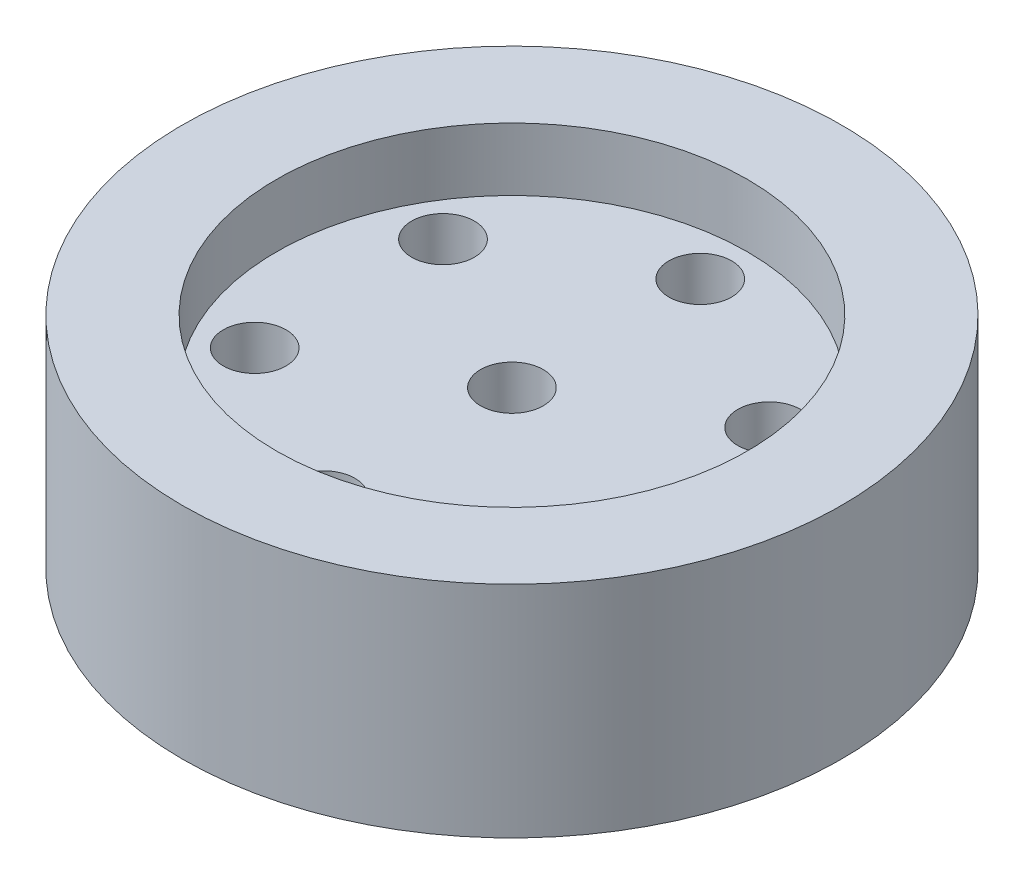
ISO-10303-21;
HEADER;
FILE_DESCRIPTION(('STEP AP214'),'2;1');
FILE_NAME('part.step','',(''),(''),'','','');
FILE_SCHEMA(('AUTOMOTIVE_DESIGN { 1 0 10303 214 1 1 1 1 }'));
ENDSEC;
DATA;
#1=APPLICATION_CONTEXT('core data for automotive mechanical design processes');
#2=APPLICATION_PROTOCOL_DEFINITION('international standard','automotive_design',2000,#1);
#3=PRODUCT_CONTEXT('',#1,'mechanical');
#4=PRODUCT('Part','Part','',(#3));
#5=PRODUCT_RELATED_PRODUCT_CATEGORY('part','',(#4));
#6=PRODUCT_DEFINITION_FORMATION('','',#4);
#7=PRODUCT_DEFINITION_CONTEXT('part definition',#1,'design');
#8=PRODUCT_DEFINITION('design','',#6,#7);
#9=PRODUCT_DEFINITION_SHAPE('','',#8);
#10=(LENGTH_UNIT() NAMED_UNIT(*) SI_UNIT(.MILLI.,.METRE.));
#11=(NAMED_UNIT(*) PLANE_ANGLE_UNIT() SI_UNIT($,.RADIAN.));
#12=(NAMED_UNIT(*) SI_UNIT($,.STERADIAN.) SOLID_ANGLE_UNIT());
#13=UNCERTAINTY_MEASURE_WITH_UNIT(LENGTH_MEASURE(1.E-05),#10,'distance_accuracy_value','');
#14=(GEOMETRIC_REPRESENTATION_CONTEXT(3) GLOBAL_UNCERTAINTY_ASSIGNED_CONTEXT((#13)) GLOBAL_UNIT_ASSIGNED_CONTEXT((#10,
#11,#12)) REPRESENTATION_CONTEXT('',''));
#15=CARTESIAN_POINT('',(0.,0.,0.));
#16=DIRECTION('',(0.,0.,1.));
#17=DIRECTION('',(1.,0.,0.));
#18=AXIS2_PLACEMENT_3D('',#15,#16,#17);
#19=CARTESIAN_POINT('',(0.,7.,0.));
#20=DIRECTION('',(0.,-1.,0.));
#21=DIRECTION('',(0.,0.,-1.));
#22=AXIS2_PLACEMENT_3D('',#19,#20,#21);
#23=CYLINDRICAL_SURFACE('',#22,21.);
#24=CARTESIAN_POINT('',(0.,7.,0.));
#25=DIRECTION('',(0.,1.,0.));
#26=DIRECTION('',(0.,0.,1.));
#27=AXIS2_PLACEMENT_3D('',#24,#25,#26);
#28=CIRCLE('',#27,21.);
#29=CARTESIAN_POINT('',(0.,7.,21.));
#30=VERTEX_POINT('',#29);
#31=EDGE_CURVE('E10',#30,#30,#28,.T.);
#32=ORIENTED_EDGE('',*,*,#31,.F.);
#33=EDGE_LOOP('',(#32));
#34=FACE_BOUND('',#33,.T.);
#35=CARTESIAN_POINT('',(0.,-7.,0.));
#36=DIRECTION('',(0.,1.,0.));
#37=DIRECTION('',(0.,0.,1.));
#38=AXIS2_PLACEMENT_3D('',#35,#36,#37);
#39=CIRCLE('',#38,21.);
#40=CARTESIAN_POINT('',(0.,-7.,21.));
#41=VERTEX_POINT('',#40);
#42=EDGE_CURVE('E49',#41,#41,#39,.T.);
#43=ORIENTED_EDGE('',*,*,#42,.T.);
#44=EDGE_LOOP('',(#43));
#45=FACE_BOUND('',#44,.T.);
#46=ADVANCED_FACE('F41',(#34,#45),#23,.T.);
#47=CARTESIAN_POINT('',(0.,7.,0.));
#48=DIRECTION('',(0.,1.,0.));
#49=DIRECTION('',(0.,0.,1.));
#50=AXIS2_PLACEMENT_3D('',#47,#48,#49);
#51=PLANE('',#50);
#52=CARTESIAN_POINT('',(0.,7.,0.));
#53=DIRECTION('',(0.,1.,0.));
#54=DIRECTION('',(0.,0.,1.));
#55=AXIS2_PLACEMENT_3D('',#52,#53,#54);
#56=CIRCLE('',#55,15.);
#57=CARTESIAN_POINT('',(0.,7.,15.));
#58=VERTEX_POINT('',#57);
#59=EDGE_CURVE('E58',#58,#58,#56,.T.);
#60=ORIENTED_EDGE('',*,*,#59,.F.);
#61=EDGE_LOOP('',(#60));
#62=FACE_BOUND('',#61,.T.);
#63=ORIENTED_EDGE('',*,*,#31,.T.);
#64=EDGE_LOOP('',(#63));
#65=FACE_BOUND('',#64,.T.);
#66=ADVANCED_FACE('F134',(#62,#65),#51,.T.);
#67=CARTESIAN_POINT('',(0.,-7.,0.));
#68=DIRECTION('',(0.,1.,0.));
#69=DIRECTION('',(0.,0.,1.));
#70=AXIS2_PLACEMENT_3D('',#67,#68,#69);
#71=PLANE('',#70);
#72=CARTESIAN_POINT('',(0.,-7.,0.));
#73=DIRECTION('',(0.,-1.,0.));
#74=DIRECTION('',(0.,0.,-1.));
#75=AXIS2_PLACEMENT_3D('',#72,#73,#74);
#76=CIRCLE('',#75,19.);
#77=CARTESIAN_POINT('',(0.,-7.,-19.));
#78=VERTEX_POINT('',#77);
#79=EDGE_CURVE('E114',#78,#78,#76,.T.);
#80=ORIENTED_EDGE('',*,*,#79,.F.);
#81=EDGE_LOOP('',(#80));
#82=FACE_BOUND('',#81,.T.);
#83=ORIENTED_EDGE('',*,*,#42,.F.);
#84=EDGE_LOOP('',(#83));
#85=FACE_BOUND('',#84,.T.);
#86=ADVANCED_FACE('F136',(#82,#85),#71,.F.);
#87=CARTESIAN_POINT('',(0.,3.,0.));
#88=DIRECTION('',(0.,1.,0.));
#89=DIRECTION('',(0.,0.,1.));
#90=AXIS2_PLACEMENT_3D('',#87,#88,#89);
#91=CYLINDRICAL_SURFACE('',#90,15.);
#92=CARTESIAN_POINT('',(0.,3.,0.));
#93=DIRECTION('',(0.,1.,0.));
#94=DIRECTION('',(0.,0.,1.));
#95=AXIS2_PLACEMENT_3D('',#92,#93,#94);
#96=CIRCLE('',#95,15.);
#97=CARTESIAN_POINT('',(0.,3.,15.));
#98=VERTEX_POINT('',#97);
#99=EDGE_CURVE('E55',#98,#98,#96,.T.);
#100=ORIENTED_EDGE('',*,*,#99,.F.);
#101=EDGE_LOOP('',(#100));
#102=FACE_BOUND('',#101,.T.);
#103=ORIENTED_EDGE('',*,*,#59,.T.);
#104=EDGE_LOOP('',(#103));
#105=FACE_BOUND('',#104,.T.);
#106=ADVANCED_FACE('F132',(#102,#105),#91,.F.);
#107=CARTESIAN_POINT('',(0.,3.,0.));
#108=DIRECTION('',(0.,1.,0.));
#109=DIRECTION('',(0.,0.,1.));
#110=AXIS2_PLACEMENT_3D('',#107,#108,#109);
#111=PLANE('',#110);
#112=CARTESIAN_POINT('',(0.,3.,12.));
#113=DIRECTION('',(0.,1.,0.));
#114=DIRECTION('',(0.,0.,1.));
#115=AXIS2_PLACEMENT_3D('',#112,#113,#114);
#116=CIRCLE('',#115,2.);
#117=CARTESIAN_POINT('',(0.,3.,14.));
#118=VERTEX_POINT('',#117);
#119=EDGE_CURVE('E97',#118,#118,#116,.T.);
#120=ORIENTED_EDGE('',*,*,#119,.F.);
#121=EDGE_LOOP('',(#120));
#122=FACE_BOUND('',#121,.T.);
#123=CARTESIAN_POINT('',(-10.3923048454132,3.,6.00000000000012));
#124=DIRECTION('',(0.,1.,0.));
#125=DIRECTION('',(0.,0.,1.));
#126=AXIS2_PLACEMENT_3D('',#123,#124,#125);
#127=CIRCLE('',#126,2.);
#128=CARTESIAN_POINT('',(-10.3923048454132,3.,8.00000000000012));
#129=VERTEX_POINT('',#128);
#130=EDGE_CURVE('E83',#129,#129,#127,.T.);
#131=ORIENTED_EDGE('',*,*,#130,.F.);
#132=EDGE_LOOP('',(#131));
#133=FACE_BOUND('',#132,.T.);
#134=CARTESIAN_POINT('',(-10.3923048454133,3.,-5.99999999999991));
#135=DIRECTION('',(0.,1.,0.));
#136=DIRECTION('',(0.,0.,1.));
#137=AXIS2_PLACEMENT_3D('',#134,#135,#136);
#138=CIRCLE('',#137,2.);
#139=CARTESIAN_POINT('',(-10.3923048454133,3.,-3.99999999999991));
#140=VERTEX_POINT('',#139);
#141=EDGE_CURVE('E79',#140,#140,#138,.T.);
#142=ORIENTED_EDGE('',*,*,#141,.F.);
#143=EDGE_LOOP('',(#142));
#144=FACE_BOUND('',#143,.T.);
#145=CARTESIAN_POINT('',(0.,3.,-12.));
#146=DIRECTION('',(0.,1.,0.));
#147=DIRECTION('',(0.,0.,1.));
#148=AXIS2_PLACEMENT_3D('',#145,#146,#147);
#149=CIRCLE('',#148,2.);
#150=CARTESIAN_POINT('',(0.,3.,-10.));
#151=VERTEX_POINT('',#150);
#152=EDGE_CURVE('E75',#151,#151,#149,.T.);
#153=ORIENTED_EDGE('',*,*,#152,.F.);
#154=EDGE_LOOP('',(#153));
#155=FACE_BOUND('',#154,.T.);
#156=CARTESIAN_POINT('',(10.3923048454132,3.,-6.00000000000005));
#157=DIRECTION('',(0.,1.,0.));
#158=DIRECTION('',(0.,0.,1.));
#159=AXIS2_PLACEMENT_3D('',#156,#157,#158);
#160=CIRCLE('',#159,2.);
#161=CARTESIAN_POINT('',(10.3923048454132,3.,-4.00000000000005));
#162=VERTEX_POINT('',#161);
#163=EDGE_CURVE('E70',#162,#162,#160,.T.);
#164=ORIENTED_EDGE('',*,*,#163,.F.);
#165=EDGE_LOOP('',(#164));
#166=FACE_BOUND('',#165,.T.);
#167=CARTESIAN_POINT('',(10.3923048454133,3.,5.99999999999998));
#168=DIRECTION('',(0.,1.,0.));
#169=DIRECTION('',(0.,0.,1.));
#170=AXIS2_PLACEMENT_3D('',#167,#168,#169);
#171=CIRCLE('',#170,2.);
#172=CARTESIAN_POINT('',(10.3923048454133,3.,7.99999999999998));
#173=VERTEX_POINT('',#172);
#174=EDGE_CURVE('E65',#173,#173,#171,.T.);
#175=ORIENTED_EDGE('',*,*,#174,.F.);
#176=EDGE_LOOP('',(#175));
#177=FACE_BOUND('',#176,.T.);
#178=CARTESIAN_POINT('',(0.,3.,0.));
#179=DIRECTION('',(0.,1.,0.));
#180=DIRECTION('',(0.,0.,1.));
#181=AXIS2_PLACEMENT_3D('',#178,#179,#180);
#182=CIRCLE('',#181,2.);
#183=CARTESIAN_POINT('',(0.,3.,2.));
#184=VERTEX_POINT('',#183);
#185=EDGE_CURVE('E105',#184,#184,#182,.T.);
#186=ORIENTED_EDGE('',*,*,#185,.F.);
#187=EDGE_LOOP('',(#186));
#188=FACE_BOUND('',#187,.T.);
#189=ORIENTED_EDGE('',*,*,#99,.T.);
#190=EDGE_LOOP('',(#189));
#191=FACE_BOUND('',#190,.T.);
#192=ADVANCED_FACE('F148',(#122,#133,#144,#155,#166,#177,#188,#191),#111,.T.);
#193=CARTESIAN_POINT('',(0.,-3.,0.));
#194=DIRECTION('',(0.,-1.,0.));
#195=DIRECTION('',(0.,0.,-1.));
#196=AXIS2_PLACEMENT_3D('',#193,#194,#195);
#197=CYLINDRICAL_SURFACE('',#196,19.);
#198=CARTESIAN_POINT('',(0.,-3.,0.));
#199=DIRECTION('',(0.,-1.,0.));
#200=DIRECTION('',(0.,0.,-1.));
#201=AXIS2_PLACEMENT_3D('',#198,#199,#200);
#202=CIRCLE('',#201,19.);
#203=CARTESIAN_POINT('',(0.,-3.,-19.));
#204=VERTEX_POINT('',#203);
#205=EDGE_CURVE('E118',#204,#204,#202,.T.);
#206=ORIENTED_EDGE('',*,*,#205,.F.);
#207=EDGE_LOOP('',(#206));
#208=FACE_BOUND('',#207,.T.);
#209=ORIENTED_EDGE('',*,*,#79,.T.);
#210=EDGE_LOOP('',(#209));
#211=FACE_BOUND('',#210,.T.);
#212=ADVANCED_FACE('F152',(#208,#211),#197,.F.);
#213=CARTESIAN_POINT('',(0.,-3.,0.));
#214=DIRECTION('',(0.,-1.,0.));
#215=DIRECTION('',(0.,0.,-1.));
#216=AXIS2_PLACEMENT_3D('',#213,#214,#215);
#217=PLANE('',#216);
#218=CARTESIAN_POINT('',(0.,-3.,12.));
#219=DIRECTION('',(0.,-1.,0.));
#220=DIRECTION('',(0.,0.,-1.));
#221=AXIS2_PLACEMENT_3D('',#218,#219,#220);
#222=CIRCLE('',#221,2.);
#223=CARTESIAN_POINT('',(0.,-3.,10.));
#224=VERTEX_POINT('',#223);
#225=EDGE_CURVE('E44',#224,#224,#222,.T.);
#226=ORIENTED_EDGE('',*,*,#225,.F.);
#227=EDGE_LOOP('',(#226));
#228=FACE_BOUND('',#227,.T.);
#229=CARTESIAN_POINT('',(-10.3923048454132,-3.,6.00000000000012));
#230=DIRECTION('',(0.,-1.,0.));
#231=DIRECTION('',(0.,0.,-1.));
#232=AXIS2_PLACEMENT_3D('',#229,#230,#231);
#233=CIRCLE('',#232,2.);
#234=CARTESIAN_POINT('',(-10.3923048454132,-3.,4.00000000000012));
#235=VERTEX_POINT('',#234);
#236=EDGE_CURVE('E80',#235,#235,#233,.T.);
#237=ORIENTED_EDGE('',*,*,#236,.F.);
#238=EDGE_LOOP('',(#237));
#239=FACE_BOUND('',#238,.T.);
#240=CARTESIAN_POINT('',(-10.3923048454133,-3.,-5.99999999999991));
#241=DIRECTION('',(0.,-1.,0.));
#242=DIRECTION('',(0.,0.,-1.));
#243=AXIS2_PLACEMENT_3D('',#240,#241,#242);
#244=CIRCLE('',#243,2.);
#245=CARTESIAN_POINT('',(-10.3923048454133,-3.,-7.99999999999991));
#246=VERTEX_POINT('',#245);
#247=EDGE_CURVE('E76',#246,#246,#244,.T.);
#248=ORIENTED_EDGE('',*,*,#247,.F.);
#249=EDGE_LOOP('',(#248));
#250=FACE_BOUND('',#249,.T.);
#251=CARTESIAN_POINT('',(0.,-3.,-12.));
#252=DIRECTION('',(0.,-1.,0.));
#253=DIRECTION('',(0.,0.,-1.));
#254=AXIS2_PLACEMENT_3D('',#251,#252,#253);
#255=CIRCLE('',#254,2.);
#256=CARTESIAN_POINT('',(0.,-3.,-14.));
#257=VERTEX_POINT('',#256);
#258=EDGE_CURVE('E71',#257,#257,#255,.T.);
#259=ORIENTED_EDGE('',*,*,#258,.F.);
#260=EDGE_LOOP('',(#259));
#261=FACE_BOUND('',#260,.T.);
#262=CARTESIAN_POINT('',(10.3923048454132,-3.,-6.00000000000005));
#263=DIRECTION('',(0.,-1.,0.));
#264=DIRECTION('',(0.,0.,-1.));
#265=AXIS2_PLACEMENT_3D('',#262,#263,#264);
#266=CIRCLE('',#265,2.);
#267=CARTESIAN_POINT('',(10.3923048454132,-3.,-8.00000000000005));
#268=VERTEX_POINT('',#267);
#269=EDGE_CURVE('E66',#268,#268,#266,.T.);
#270=ORIENTED_EDGE('',*,*,#269,.F.);
#271=EDGE_LOOP('',(#270));
#272=FACE_BOUND('',#271,.T.);
#273=CARTESIAN_POINT('',(10.3923048454133,-3.,5.99999999999998));
#274=DIRECTION('',(0.,-1.,0.));
#275=DIRECTION('',(0.,0.,-1.));
#276=AXIS2_PLACEMENT_3D('',#273,#274,#275);
#277=CIRCLE('',#276,2.);
#278=CARTESIAN_POINT('',(10.3923048454133,-3.,3.99999999999997));
#279=VERTEX_POINT('',#278);
#280=EDGE_CURVE('E61',#279,#279,#277,.T.);
#281=ORIENTED_EDGE('',*,*,#280,.F.);
#282=EDGE_LOOP('',(#281));
#283=FACE_BOUND('',#282,.T.);
#284=CARTESIAN_POINT('',(0.,-3.,0.));
#285=DIRECTION('',(0.,-1.,0.));
#286=DIRECTION('',(0.,0.,-1.));
#287=AXIS2_PLACEMENT_3D('',#284,#285,#286);
#288=CIRCLE('',#287,5.);
#289=CARTESIAN_POINT('',(0.,-3.,-5.));
#290=VERTEX_POINT('',#289);
#291=EDGE_CURVE('E110',#290,#290,#288,.T.);
#292=ORIENTED_EDGE('',*,*,#291,.F.);
#293=EDGE_LOOP('',(#292));
#294=FACE_BOUND('',#293,.T.);
#295=ORIENTED_EDGE('',*,*,#205,.T.);
#296=EDGE_LOOP('',(#295));
#297=FACE_BOUND('',#296,.T.);
#298=ADVANCED_FACE('F156',(#228,#239,#250,#261,#272,#283,#294,#297),#217,.T.);
#299=CARTESIAN_POINT('',(0.,-3.,0.));
#300=DIRECTION('',(0.,-1.,0.));
#301=DIRECTION('',(0.,0.,-1.));
#302=AXIS2_PLACEMENT_3D('',#299,#300,#301);
#303=CYLINDRICAL_SURFACE('',#302,5.);
#304=ORIENTED_EDGE('',*,*,#291,.T.);
#305=EDGE_LOOP('',(#304));
#306=FACE_BOUND('',#305,.T.);
#307=CARTESIAN_POINT('',(0.,-7.,0.));
#308=DIRECTION('',(0.,-1.,0.));
#309=DIRECTION('',(0.,0.,-1.));
#310=AXIS2_PLACEMENT_3D('',#307,#308,#309);
#311=CIRCLE('',#310,5.);
#312=CARTESIAN_POINT('',(0.,-7.,-5.));
#313=VERTEX_POINT('',#312);
#314=EDGE_CURVE('E109',#313,#313,#311,.T.);
#315=ORIENTED_EDGE('',*,*,#314,.F.);
#316=EDGE_LOOP('',(#315));
#317=FACE_BOUND('',#316,.T.);
#318=ADVANCED_FACE('F160',(#306,#317),#303,.T.);
#319=CARTESIAN_POINT('',(0.,-7.,0.));
#320=DIRECTION('',(0.,-1.,0.));
#321=DIRECTION('',(0.,0.,-1.));
#322=AXIS2_PLACEMENT_3D('',#319,#320,#321);
#323=CIRCLE('',#322,2.);
#324=CARTESIAN_POINT('',(0.,-7.,-2.));
#325=VERTEX_POINT('',#324);
#326=EDGE_CURVE('E101',#325,#325,#323,.T.);
#327=ORIENTED_EDGE('',*,*,#326,.F.);
#328=EDGE_LOOP('',(#327));
#329=FACE_BOUND('',#328,.T.);
#330=ORIENTED_EDGE('',*,*,#314,.T.);
#331=EDGE_LOOP('',(#330));
#332=FACE_BOUND('',#331,.T.);
#333=ADVANCED_FACE('F143',(#329,#332),#71,.F.);
#334=CARTESIAN_POINT('',(0.,7.,0.));
#335=DIRECTION('',(0.,-1.,0.));
#336=DIRECTION('',(0.,0.,-1.));
#337=AXIS2_PLACEMENT_3D('',#334,#335,#336);
#338=CYLINDRICAL_SURFACE('',#337,2.);
#339=ORIENTED_EDGE('',*,*,#185,.T.);
#340=EDGE_LOOP('',(#339));
#341=FACE_BOUND('',#340,.T.);
#342=ORIENTED_EDGE('',*,*,#326,.T.);
#343=EDGE_LOOP('',(#342));
#344=FACE_BOUND('',#343,.T.);
#345=ADVANCED_FACE('F165',(#341,#344),#338,.F.);
#346=CARTESIAN_POINT('',(10.3923048454133,26.,5.99999999999998));
#347=DIRECTION('',(0.,-1.,0.));
#348=DIRECTION('',(0.,0.,-1.));
#349=AXIS2_PLACEMENT_3D('',#346,#347,#348);
#350=CYLINDRICAL_SURFACE('',#349,2.);
#351=ORIENTED_EDGE('',*,*,#174,.T.);
#352=EDGE_LOOP('',(#351));
#353=FACE_BOUND('',#352,.T.);
#354=ORIENTED_EDGE('',*,*,#280,.T.);
#355=EDGE_LOOP('',(#354));
#356=FACE_BOUND('',#355,.T.);
#357=ADVANCED_FACE('F168',(#353,#356),#350,.F.);
#358=CARTESIAN_POINT('',(10.3923048454132,26.,-6.00000000000005));
#359=DIRECTION('',(0.,-1.,0.));
#360=DIRECTION('',(0.,0.,-1.));
#361=AXIS2_PLACEMENT_3D('',#358,#359,#360);
#362=CYLINDRICAL_SURFACE('',#361,2.);
#363=ORIENTED_EDGE('',*,*,#163,.T.);
#364=EDGE_LOOP('',(#363));
#365=FACE_BOUND('',#364,.T.);
#366=ORIENTED_EDGE('',*,*,#269,.T.);
#367=EDGE_LOOP('',(#366));
#368=FACE_BOUND('',#367,.T.);
#369=ADVANCED_FACE('F177',(#365,#368),#362,.F.);
#370=CARTESIAN_POINT('',(0.,26.,-12.));
#371=DIRECTION('',(0.,-1.,0.));
#372=DIRECTION('',(0.,0.,-1.));
#373=AXIS2_PLACEMENT_3D('',#370,#371,#372);
#374=CYLINDRICAL_SURFACE('',#373,2.);
#375=ORIENTED_EDGE('',*,*,#152,.T.);
#376=EDGE_LOOP('',(#375));
#377=FACE_BOUND('',#376,.T.);
#378=ORIENTED_EDGE('',*,*,#258,.T.);
#379=EDGE_LOOP('',(#378));
#380=FACE_BOUND('',#379,.T.);
#381=ADVANCED_FACE('F174',(#377,#380),#374,.F.);
#382=CARTESIAN_POINT('',(-10.3923048454133,26.,-5.99999999999991));
#383=DIRECTION('',(0.,-1.,0.));
#384=DIRECTION('',(0.,0.,-1.));
#385=AXIS2_PLACEMENT_3D('',#382,#383,#384);
#386=CYLINDRICAL_SURFACE('',#385,2.);
#387=ORIENTED_EDGE('',*,*,#141,.T.);
#388=EDGE_LOOP('',(#387));
#389=FACE_BOUND('',#388,.T.);
#390=ORIENTED_EDGE('',*,*,#247,.T.);
#391=EDGE_LOOP('',(#390));
#392=FACE_BOUND('',#391,.T.);
#393=ADVANCED_FACE('F170',(#389,#392),#386,.F.);
#394=CARTESIAN_POINT('',(-10.3923048454132,26.,6.00000000000012));
#395=DIRECTION('',(0.,-1.,0.));
#396=DIRECTION('',(0.,0.,-1.));
#397=AXIS2_PLACEMENT_3D('',#394,#395,#396);
#398=CYLINDRICAL_SURFACE('',#397,2.);
#399=ORIENTED_EDGE('',*,*,#130,.T.);
#400=EDGE_LOOP('',(#399));
#401=FACE_BOUND('',#400,.T.);
#402=ORIENTED_EDGE('',*,*,#236,.T.);
#403=EDGE_LOOP('',(#402));
#404=FACE_BOUND('',#403,.T.);
#405=ADVANCED_FACE('F173',(#401,#404),#398,.F.);
#406=CARTESIAN_POINT('',(0.,26.,12.));
#407=DIRECTION('',(0.,-1.,0.));
#408=DIRECTION('',(0.,0.,-1.));
#409=AXIS2_PLACEMENT_3D('',#406,#407,#408);
#410=CYLINDRICAL_SURFACE('',#409,2.);
#411=ORIENTED_EDGE('',*,*,#119,.T.);
#412=EDGE_LOOP('',(#411));
#413=FACE_BOUND('',#412,.T.);
#414=ORIENTED_EDGE('',*,*,#225,.T.);
#415=EDGE_LOOP('',(#414));
#416=FACE_BOUND('',#415,.T.);
#417=ADVANCED_FACE('F187',(#413,#416),#410,.F.);
#418=CLOSED_SHELL('',(#46,#66,#86,#106,#192,#212,#298,#318,#333,#345,#357,#369,#381,#393,#405,#417));
#419=MANIFOLD_SOLID_BREP('B2',#418);
#420=ADVANCED_BREP_SHAPE_REPRESENTATION('',(#18,#419),#14);
#421=SHAPE_DEFINITION_REPRESENTATION(#9,#420);
ENDSEC;
END-ISO-10303-21;
